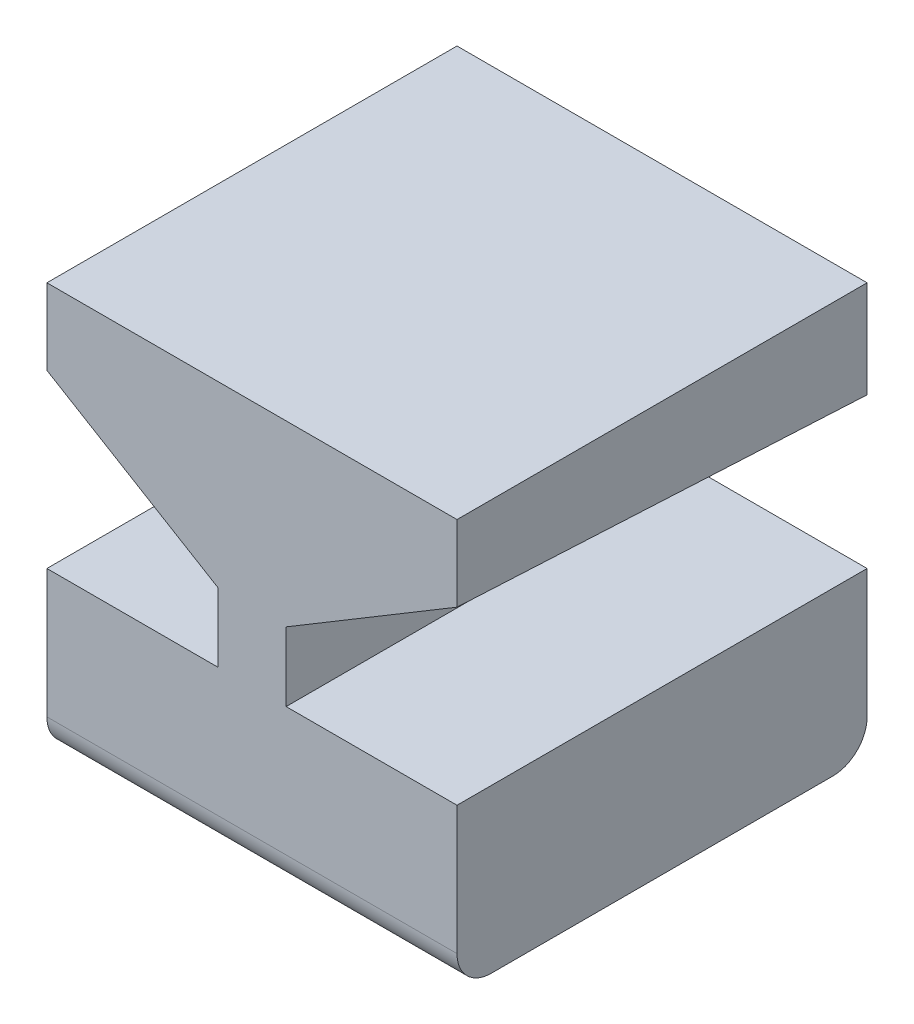
ISO-10303-21;
HEADER;
FILE_DESCRIPTION(('STEP AP214'),'2;1');
FILE_NAME('part.step','',(''),(''),'','','');
FILE_SCHEMA(('AUTOMOTIVE_DESIGN { 1 0 10303 214 1 1 1 1 }'));
ENDSEC;
DATA;
#1=APPLICATION_CONTEXT('core data for automotive mechanical design processes');
#2=APPLICATION_PROTOCOL_DEFINITION('international standard','automotive_design',2000,#1);
#3=PRODUCT_CONTEXT('',#1,'mechanical');
#4=PRODUCT('Part','Part','',(#3));
#5=PRODUCT_RELATED_PRODUCT_CATEGORY('part','',(#4));
#6=PRODUCT_DEFINITION_FORMATION('','',#4);
#7=PRODUCT_DEFINITION_CONTEXT('part definition',#1,'design');
#8=PRODUCT_DEFINITION('design','',#6,#7);
#9=PRODUCT_DEFINITION_SHAPE('','',#8);
#10=(LENGTH_UNIT() NAMED_UNIT(*) SI_UNIT(.MILLI.,.METRE.));
#11=(NAMED_UNIT(*) PLANE_ANGLE_UNIT() SI_UNIT($,.RADIAN.));
#12=(NAMED_UNIT(*) SI_UNIT($,.STERADIAN.) SOLID_ANGLE_UNIT());
#13=UNCERTAINTY_MEASURE_WITH_UNIT(LENGTH_MEASURE(1.E-05),#10,'distance_accuracy_value','');
#14=(GEOMETRIC_REPRESENTATION_CONTEXT(3) GLOBAL_UNCERTAINTY_ASSIGNED_CONTEXT((#13)) GLOBAL_UNIT_ASSIGNED_CONTEXT((#10,
#11,#12)) REPRESENTATION_CONTEXT('',''));
#15=CARTESIAN_POINT('',(0.,0.,0.));
#16=DIRECTION('',(0.,0.,1.));
#17=DIRECTION('',(1.,0.,0.));
#18=AXIS2_PLACEMENT_3D('',#15,#16,#17);
#19=CARTESIAN_POINT('',(0.,23.8,60.));
#20=DIRECTION('',(1.,0.,0.));
#21=DIRECTION('',(0.,0.,-1.));
#22=AXIS2_PLACEMENT_3D('',#19,#20,#21);
#23=PLANE('',#22);
#24=DIRECTION('',(0.,-1.,0.));
#25=VECTOR('',#24,1.);
#26=CARTESIAN_POINT('',(0.,23.8,0.));
#27=LINE('',#26,#25);
#28=CARTESIAN_POINT('',(0.,23.8,0.));
#29=VERTEX_POINT('',#28);
#30=CARTESIAN_POINT('',(0.,5.00000000000001,0.));
#31=VERTEX_POINT('',#30);
#32=EDGE_CURVE('E192',#29,#31,#27,.T.);
#33=ORIENTED_EDGE('',*,*,#32,.T.);
#34=CARTESIAN_POINT('',(0.,5.,5.));
#35=DIRECTION('',(1.,0.,0.));
#36=DIRECTION('',(0.,0.,-1.));
#37=AXIS2_PLACEMENT_3D('',#34,#35,#36);
#38=CIRCLE('',#37,5.);
#39=CARTESIAN_POINT('',(0.,0.,5.));
#40=VERTEX_POINT('',#39);
#41=EDGE_CURVE('E47',#31,#40,#38,.F.);
#42=ORIENTED_EDGE('',*,*,#41,.T.);
#43=DIRECTION('',(0.,0.,-1.));
#44=VECTOR('',#43,1.);
#45=CARTESIAN_POINT('',(0.,0.,60.));
#46=LINE('',#45,#44);
#47=CARTESIAN_POINT('',(0.,0.,55.));
#48=VERTEX_POINT('',#47);
#49=EDGE_CURVE('E251',#48,#40,#46,.T.);
#50=ORIENTED_EDGE('',*,*,#49,.F.);
#51=CARTESIAN_POINT('',(0.,5.,55.));
#52=DIRECTION('',(1.,0.,0.));
#53=DIRECTION('',(0.,0.,-1.));
#54=AXIS2_PLACEMENT_3D('',#51,#52,#53);
#55=CIRCLE('',#54,5.);
#56=CARTESIAN_POINT('',(0.,5.00000000000001,60.));
#57=VERTEX_POINT('',#56);
#58=EDGE_CURVE('E54',#48,#57,#55,.F.);
#59=ORIENTED_EDGE('',*,*,#58,.T.);
#60=DIRECTION('',(0.,-1.,0.));
#61=VECTOR('',#60,1.);
#62=CARTESIAN_POINT('',(0.,23.8,60.));
#63=LINE('',#62,#61);
#64=CARTESIAN_POINT('',(0.,23.8,60.));
#65=VERTEX_POINT('',#64);
#66=EDGE_CURVE('E225',#65,#57,#63,.T.);
#67=ORIENTED_EDGE('',*,*,#66,.F.);
#68=DIRECTION('',(0.,0.,-1.));
#69=VECTOR('',#68,1.);
#70=CARTESIAN_POINT('',(0.,23.8,60.));
#71=LINE('',#70,#69);
#72=EDGE_CURVE('E191',#65,#29,#71,.T.);
#73=ORIENTED_EDGE('',*,*,#72,.T.);
#74=EDGE_LOOP('',(#33,#42,#50,#59,#67,#73));
#75=FACE_BOUND('',#74,.T.);
#76=ADVANCED_FACE('F38',(#75),#23,.F.);
#77=CARTESIAN_POINT('',(0.,0.,60.));
#78=DIRECTION('',(0.,1.,0.));
#79=DIRECTION('',(0.,0.,1.));
#80=AXIS2_PLACEMENT_3D('',#77,#78,#79);
#81=PLANE('',#80);
#82=ORIENTED_EDGE('',*,*,#49,.T.);
#83=DIRECTION('',(1.,0.,0.));
#84=VECTOR('',#83,1.);
#85=CARTESIAN_POINT('',(0.,0.,5.));
#86=LINE('',#85,#84);
#87=CARTESIAN_POINT('',(60.,0.,5.));
#88=VERTEX_POINT('',#87);
#89=EDGE_CURVE('E258',#40,#88,#86,.T.);
#90=ORIENTED_EDGE('',*,*,#89,.T.);
#91=DIRECTION('',(0.,0.,-1.));
#92=VECTOR('',#91,1.);
#93=CARTESIAN_POINT('',(60.,0.,60.));
#94=LINE('',#93,#92);
#95=CARTESIAN_POINT('',(60.,0.,55.));
#96=VERTEX_POINT('',#95);
#97=EDGE_CURVE('E247',#96,#88,#94,.T.);
#98=ORIENTED_EDGE('',*,*,#97,.F.);
#99=DIRECTION('',(1.,0.,0.));
#100=VECTOR('',#99,1.);
#101=CARTESIAN_POINT('',(0.,0.,55.));
#102=LINE('',#101,#100);
#103=EDGE_CURVE('E255',#96,#48,#102,.F.);
#104=ORIENTED_EDGE('',*,*,#103,.T.);
#105=EDGE_LOOP('',(#82,#90,#98,#104));
#106=FACE_BOUND('',#105,.T.);
#107=ADVANCED_FACE('F276',(#106),#81,.F.);
#108=CARTESIAN_POINT('',(60.,0.,60.));
#109=DIRECTION('',(-1.,0.,0.));
#110=DIRECTION('',(0.,0.,1.));
#111=AXIS2_PLACEMENT_3D('',#108,#109,#110);
#112=PLANE('',#111);
#113=ORIENTED_EDGE('',*,*,#97,.T.);
#114=CARTESIAN_POINT('',(60.,5.,5.));
#115=DIRECTION('',(-1.,0.,0.));
#116=DIRECTION('',(0.,0.,1.));
#117=AXIS2_PLACEMENT_3D('',#114,#115,#116);
#118=CIRCLE('',#117,5.);
#119=CARTESIAN_POINT('',(60.,5.,0.));
#120=VERTEX_POINT('',#119);
#121=EDGE_CURVE('E265',#88,#120,#118,.F.);
#122=ORIENTED_EDGE('',*,*,#121,.T.);
#123=DIRECTION('',(0.,1.,0.));
#124=VECTOR('',#123,1.);
#125=CARTESIAN_POINT('',(60.,0.,0.));
#126=LINE('',#125,#124);
#127=CARTESIAN_POINT('',(60.,23.8,0.));
#128=VERTEX_POINT('',#127);
#129=EDGE_CURVE('E195',#120,#128,#126,.T.);
#130=ORIENTED_EDGE('',*,*,#129,.T.);
#131=DIRECTION('',(0.,0.,-1.));
#132=VECTOR('',#131,1.);
#133=CARTESIAN_POINT('',(60.,23.8,60.));
#134=LINE('',#133,#132);
#135=CARTESIAN_POINT('',(60.,23.8,60.));
#136=VERTEX_POINT('',#135);
#137=EDGE_CURVE('E243',#136,#128,#134,.T.);
#138=ORIENTED_EDGE('',*,*,#137,.F.);
#139=DIRECTION('',(0.,1.,0.));
#140=VECTOR('',#139,1.);
#141=CARTESIAN_POINT('',(60.,0.,60.));
#142=LINE('',#141,#140);
#143=CARTESIAN_POINT('',(60.,5.,60.));
#144=VERTEX_POINT('',#143);
#145=EDGE_CURVE('E307',#144,#136,#142,.T.);
#146=ORIENTED_EDGE('',*,*,#145,.F.);
#147=CARTESIAN_POINT('',(60.,5.,55.));
#148=DIRECTION('',(-1.,0.,0.));
#149=DIRECTION('',(0.,0.,1.));
#150=AXIS2_PLACEMENT_3D('',#147,#148,#149);
#151=CIRCLE('',#150,5.);
#152=EDGE_CURVE('E262',#144,#96,#151,.F.);
#153=ORIENTED_EDGE('',*,*,#152,.T.);
#154=EDGE_LOOP('',(#113,#122,#130,#138,#146,#153));
#155=FACE_BOUND('',#154,.T.);
#156=ADVANCED_FACE('F281',(#155),#112,.F.);
#157=CARTESIAN_POINT('',(60.,23.8,60.));
#158=DIRECTION('',(0.,-1.,0.));
#159=DIRECTION('',(1.,0.,0.));
#160=AXIS2_PLACEMENT_3D('',#157,#158,#159);
#161=PLANE('',#160);
#162=DIRECTION('',(-1.,0.,0.));
#163=VECTOR('',#162,1.);
#164=CARTESIAN_POINT('',(60.,23.8,0.));
#165=LINE('',#164,#163);
#166=CARTESIAN_POINT('',(35.,23.8,0.));
#167=VERTEX_POINT('',#166);
#168=EDGE_CURVE('E198',#128,#167,#165,.T.);
#169=ORIENTED_EDGE('',*,*,#168,.T.);
#170=DIRECTION('',(0.,0.,-1.));
#171=VECTOR('',#170,1.);
#172=CARTESIAN_POINT('',(35.,23.8,60.));
#173=LINE('',#172,#171);
#174=CARTESIAN_POINT('',(35.,23.8,60.));
#175=VERTEX_POINT('',#174);
#176=EDGE_CURVE('E239',#175,#167,#173,.T.);
#177=ORIENTED_EDGE('',*,*,#176,.F.);
#178=DIRECTION('',(-1.,0.,0.));
#179=VECTOR('',#178,1.);
#180=CARTESIAN_POINT('',(60.,23.8,60.));
#181=LINE('',#180,#179);
#182=EDGE_CURVE('E178',#136,#175,#181,.T.);
#183=ORIENTED_EDGE('',*,*,#182,.F.);
#184=ORIENTED_EDGE('',*,*,#137,.T.);
#185=EDGE_LOOP('',(#169,#177,#183,#184));
#186=FACE_BOUND('',#185,.T.);
#187=ADVANCED_FACE('F288',(#186),#161,.F.);
#188=CARTESIAN_POINT('',(35.,23.8,60.));
#189=DIRECTION('',(-1.,0.,0.));
#190=DIRECTION('',(0.,0.,1.));
#191=AXIS2_PLACEMENT_3D('',#188,#189,#190);
#192=PLANE('',#191);
#193=DIRECTION('',(0.,1.,0.));
#194=VECTOR('',#193,1.);
#195=CARTESIAN_POINT('',(35.,23.8,0.));
#196=LINE('',#195,#194);
#197=CARTESIAN_POINT('',(35.,30.8,0.));
#198=VERTEX_POINT('',#197);
#199=EDGE_CURVE('E201',#167,#198,#196,.T.);
#200=ORIENTED_EDGE('',*,*,#199,.T.);
#201=DIRECTION('',(0.,0.0515978437770678,0.998667944072281));
#202=VECTOR('',#201,1.);
#203=CARTESIAN_POINT('',(35.,29.2064024150824,-30.8438242242116));
#204=LINE('',#203,#202);
#205=CARTESIAN_POINT('',(35.,33.9,60.));
#206=VERTEX_POINT('',#205);
#207=EDGE_CURVE('E155',#198,#206,#204,.T.);
#208=ORIENTED_EDGE('',*,*,#207,.T.);
#209=DIRECTION('',(0.,1.,0.));
#210=VECTOR('',#209,1.);
#211=CARTESIAN_POINT('',(35.,23.8,60.));
#212=LINE('',#211,#210);
#213=EDGE_CURVE('E162',#175,#206,#212,.T.);
#214=ORIENTED_EDGE('',*,*,#213,.F.);
#215=ORIENTED_EDGE('',*,*,#176,.T.);
#216=EDGE_LOOP('',(#200,#208,#214,#215));
#217=FACE_BOUND('',#216,.T.);
#218=ADVANCED_FACE('F291',(#217),#192,.F.);
#219=CARTESIAN_POINT('',(60.,45.8,60.));
#220=DIRECTION('',(-1.,0.,0.));
#221=DIRECTION('',(0.,0.,1.));
#222=AXIS2_PLACEMENT_3D('',#219,#220,#221);
#223=PLANE('',#222);
#224=DIRECTION('',(0.,1.,0.));
#225=VECTOR('',#224,1.);
#226=CARTESIAN_POINT('',(60.,45.8,60.));
#227=LINE('',#226,#225);
#228=CARTESIAN_POINT('',(60.,48.9,60.));
#229=VERTEX_POINT('',#228);
#230=CARTESIAN_POINT('',(60.,60.,60.));
#231=VERTEX_POINT('',#230);
#232=EDGE_CURVE('E159',#229,#231,#227,.T.);
#233=ORIENTED_EDGE('',*,*,#232,.F.);
#234=DIRECTION('',(0.,0.0515978437770678,0.998667944072281));
#235=VECTOR('',#234,1.);
#236=CARTESIAN_POINT('',(60.,44.2064024150824,-30.8438242242116));
#237=LINE('',#236,#235);
#238=CARTESIAN_POINT('',(60.,45.8,0.));
#239=VERTEX_POINT('',#238);
#240=EDGE_CURVE('E144',#239,#229,#237,.T.);
#241=ORIENTED_EDGE('',*,*,#240,.F.);
#242=DIRECTION('',(0.,1.,0.));
#243=VECTOR('',#242,1.);
#244=CARTESIAN_POINT('',(60.,45.8,0.));
#245=LINE('',#244,#243);
#246=CARTESIAN_POINT('',(60.,60.,0.));
#247=VERTEX_POINT('',#246);
#248=EDGE_CURVE('E206',#239,#247,#245,.T.);
#249=ORIENTED_EDGE('',*,*,#248,.T.);
#250=DIRECTION('',(0.,0.,-1.));
#251=VECTOR('',#250,1.);
#252=CARTESIAN_POINT('',(60.,60.,60.));
#253=LINE('',#252,#251);
#254=EDGE_CURVE('E169',#231,#247,#253,.T.);
#255=ORIENTED_EDGE('',*,*,#254,.F.);
#256=EDGE_LOOP('',(#233,#241,#249,#255));
#257=FACE_BOUND('',#256,.T.);
#258=ADVANCED_FACE('F167',(#257),#223,.F.);
#259=CARTESIAN_POINT('',(60.,60.,60.));
#260=DIRECTION('',(0.,-1.,0.));
#261=DIRECTION('',(0.,0.,-1.));
#262=AXIS2_PLACEMENT_3D('',#259,#260,#261);
#263=PLANE('',#262);
#264=DIRECTION('',(-1.,0.,0.));
#265=VECTOR('',#264,1.);
#266=CARTESIAN_POINT('',(60.,60.,0.));
#267=LINE('',#266,#265);
#268=CARTESIAN_POINT('',(0.,60.,0.));
#269=VERTEX_POINT('',#268);
#270=EDGE_CURVE('E209',#247,#269,#267,.T.);
#271=ORIENTED_EDGE('',*,*,#270,.T.);
#272=DIRECTION('',(0.,0.,-1.));
#273=VECTOR('',#272,1.);
#274=CARTESIAN_POINT('',(0.,60.,60.));
#275=LINE('',#274,#273);
#276=CARTESIAN_POINT('',(0.,60.,60.));
#277=VERTEX_POINT('',#276);
#278=EDGE_CURVE('E233',#277,#269,#275,.T.);
#279=ORIENTED_EDGE('',*,*,#278,.F.);
#280=DIRECTION('',(-1.,0.,0.));
#281=VECTOR('',#280,1.);
#282=CARTESIAN_POINT('',(60.,60.,60.));
#283=LINE('',#282,#281);
#284=EDGE_CURVE('E172',#231,#277,#283,.T.);
#285=ORIENTED_EDGE('',*,*,#284,.F.);
#286=ORIENTED_EDGE('',*,*,#254,.T.);
#287=EDGE_LOOP('',(#271,#279,#285,#286));
#288=FACE_BOUND('',#287,.T.);
#289=ADVANCED_FACE('F332',(#288),#263,.F.);
#290=CARTESIAN_POINT('',(0.,60.,60.));
#291=DIRECTION('',(1.,0.,0.));
#292=DIRECTION('',(0.,1.,0.));
#293=AXIS2_PLACEMENT_3D('',#290,#291,#292);
#294=PLANE('',#293);
#295=DIRECTION('',(0.,-1.,0.));
#296=VECTOR('',#295,1.);
#297=CARTESIAN_POINT('',(0.,60.,0.));
#298=LINE('',#297,#296);
#299=CARTESIAN_POINT('',(0.,45.8,0.));
#300=VERTEX_POINT('',#299);
#301=EDGE_CURVE('E212',#269,#300,#298,.T.);
#302=ORIENTED_EDGE('',*,*,#301,.T.);
#303=DIRECTION('',(0.,0.0515978437770678,0.998667944072281));
#304=VECTOR('',#303,1.);
#305=CARTESIAN_POINT('',(0.,44.2064024150824,-30.8438242242116));
#306=LINE('',#305,#304);
#307=CARTESIAN_POINT('',(0.,48.9,60.));
#308=VERTEX_POINT('',#307);
#309=EDGE_CURVE('E165',#300,#308,#306,.T.);
#310=ORIENTED_EDGE('',*,*,#309,.T.);
#311=DIRECTION('',(0.,-1.,0.));
#312=VECTOR('',#311,1.);
#313=CARTESIAN_POINT('',(0.,60.,60.));
#314=LINE('',#313,#312);
#315=EDGE_CURVE('E176',#277,#308,#314,.T.);
#316=ORIENTED_EDGE('',*,*,#315,.F.);
#317=ORIENTED_EDGE('',*,*,#278,.T.);
#318=EDGE_LOOP('',(#302,#310,#316,#317));
#319=FACE_BOUND('',#318,.T.);
#320=ADVANCED_FACE('F335',(#319),#294,.F.);
#321=CARTESIAN_POINT('',(25.,30.8,60.));
#322=DIRECTION('',(1.,0.,0.));
#323=DIRECTION('',(0.,0.,-1.));
#324=AXIS2_PLACEMENT_3D('',#321,#322,#323);
#325=PLANE('',#324);
#326=DIRECTION('',(0.,-1.,0.));
#327=VECTOR('',#326,1.);
#328=CARTESIAN_POINT('',(25.,30.8,60.));
#329=LINE('',#328,#327);
#330=CARTESIAN_POINT('',(25.,33.9,60.));
#331=VERTEX_POINT('',#330);
#332=CARTESIAN_POINT('',(25.,23.8,60.));
#333=VERTEX_POINT('',#332);
#334=EDGE_CURVE('E185',#331,#333,#329,.T.);
#335=ORIENTED_EDGE('',*,*,#334,.F.);
#336=DIRECTION('',(0.,0.0515978437770678,0.998667944072281));
#337=VECTOR('',#336,1.);
#338=CARTESIAN_POINT('',(25.,29.2064024150824,-30.8438242242116));
#339=LINE('',#338,#337);
#340=CARTESIAN_POINT('',(25.,30.8,0.));
#341=VERTEX_POINT('',#340);
#342=EDGE_CURVE('E298',#341,#331,#339,.T.);
#343=ORIENTED_EDGE('',*,*,#342,.F.);
#344=DIRECTION('',(0.,-1.,0.));
#345=VECTOR('',#344,1.);
#346=CARTESIAN_POINT('',(25.,30.8,0.));
#347=LINE('',#346,#345);
#348=CARTESIAN_POINT('',(25.,23.8,0.));
#349=VERTEX_POINT('',#348);
#350=EDGE_CURVE('E219',#341,#349,#347,.T.);
#351=ORIENTED_EDGE('',*,*,#350,.T.);
#352=DIRECTION('',(0.,0.,-1.));
#353=VECTOR('',#352,1.);
#354=CARTESIAN_POINT('',(25.,23.8,60.));
#355=LINE('',#354,#353);
#356=EDGE_CURVE('E229',#333,#349,#355,.T.);
#357=ORIENTED_EDGE('',*,*,#356,.F.);
#358=EDGE_LOOP('',(#335,#343,#351,#357));
#359=FACE_BOUND('',#358,.T.);
#360=ADVANCED_FACE('F339',(#359),#325,.F.);
#361=CARTESIAN_POINT('',(25.,23.8,60.));
#362=DIRECTION('',(0.,-1.,0.));
#363=DIRECTION('',(1.,0.,0.));
#364=AXIS2_PLACEMENT_3D('',#361,#362,#363);
#365=PLANE('',#364);
#366=DIRECTION('',(-1.,0.,0.));
#367=VECTOR('',#366,1.);
#368=CARTESIAN_POINT('',(25.,23.8,0.));
#369=LINE('',#368,#367);
#370=EDGE_CURVE('E222',#349,#29,#369,.T.);
#371=ORIENTED_EDGE('',*,*,#370,.T.);
#372=ORIENTED_EDGE('',*,*,#72,.F.);
#373=DIRECTION('',(-1.,0.,0.));
#374=VECTOR('',#373,1.);
#375=CARTESIAN_POINT('',(25.,23.8,60.));
#376=LINE('',#375,#374);
#377=EDGE_CURVE('E188',#333,#65,#376,.T.);
#378=ORIENTED_EDGE('',*,*,#377,.F.);
#379=ORIENTED_EDGE('',*,*,#356,.T.);
#380=EDGE_LOOP('',(#371,#372,#378,#379));
#381=FACE_BOUND('',#380,.T.);
#382=ADVANCED_FACE('F343',(#381),#365,.F.);
#383=CARTESIAN_POINT('',(0.,0.,60.));
#384=DIRECTION('',(0.,0.,1.));
#385=DIRECTION('',(1.,0.,0.));
#386=AXIS2_PLACEMENT_3D('',#383,#384,#385);
#387=PLANE('',#386);
#388=ORIENTED_EDGE('',*,*,#66,.T.);
#389=DIRECTION('',(1.,0.,0.));
#390=VECTOR('',#389,1.);
#391=CARTESIAN_POINT('',(60.,5.,60.));
#392=LINE('',#391,#390);
#393=EDGE_CURVE('E11',#57,#144,#392,.T.);
#394=ORIENTED_EDGE('',*,*,#393,.T.);
#395=ORIENTED_EDGE('',*,*,#145,.T.);
#396=ORIENTED_EDGE('',*,*,#182,.T.);
#397=ORIENTED_EDGE('',*,*,#213,.T.);
#398=DIRECTION('',(-0.857492925712544,-0.514495755427526,0.));
#399=VECTOR('',#398,1.);
#400=CARTESIAN_POINT('',(35.,33.9,60.));
#401=LINE('',#400,#399);
#402=EDGE_CURVE('E148',#229,#206,#401,.T.);
#403=ORIENTED_EDGE('',*,*,#402,.F.);
#404=ORIENTED_EDGE('',*,*,#232,.T.);
#405=ORIENTED_EDGE('',*,*,#284,.T.);
#406=ORIENTED_EDGE('',*,*,#315,.T.);
#407=DIRECTION('',(-0.857492925712544,0.514495755427526,0.));
#408=VECTOR('',#407,1.);
#409=CARTESIAN_POINT('',(0.,48.9,60.));
#410=LINE('',#409,#408);
#411=EDGE_CURVE('E295',#331,#308,#410,.T.);
#412=ORIENTED_EDGE('',*,*,#411,.F.);
#413=ORIENTED_EDGE('',*,*,#334,.T.);
#414=ORIENTED_EDGE('',*,*,#377,.T.);
#415=EDGE_LOOP('',(#388,#394,#395,#396,#397,#403,#404,#405,#406,#412,#413,#414));
#416=FACE_BOUND('',#415,.T.);
#417=ADVANCED_FACE('F158',(#416),#387,.T.);
#418=CARTESIAN_POINT('',(0.,0.,0.));
#419=DIRECTION('',(0.,0.,1.));
#420=DIRECTION('',(1.,0.,0.));
#421=AXIS2_PLACEMENT_3D('',#418,#419,#420);
#422=PLANE('',#421);
#423=ORIENTED_EDGE('',*,*,#129,.F.);
#424=DIRECTION('',(1.,0.,0.));
#425=VECTOR('',#424,1.);
#426=CARTESIAN_POINT('',(0.,5.,0.));
#427=LINE('',#426,#425);
#428=EDGE_CURVE('E62',#120,#31,#427,.F.);
#429=ORIENTED_EDGE('',*,*,#428,.T.);
#430=ORIENTED_EDGE('',*,*,#32,.F.);
#431=ORIENTED_EDGE('',*,*,#370,.F.);
#432=ORIENTED_EDGE('',*,*,#350,.F.);
#433=DIRECTION('',(0.857492925712544,-0.514495755427526,0.));
#434=VECTOR('',#433,1.);
#435=CARTESIAN_POINT('',(0.,45.8,0.));
#436=LINE('',#435,#434);
#437=EDGE_CURVE('E216',#300,#341,#436,.T.);
#438=ORIENTED_EDGE('',*,*,#437,.F.);
#439=ORIENTED_EDGE('',*,*,#301,.F.);
#440=ORIENTED_EDGE('',*,*,#270,.F.);
#441=ORIENTED_EDGE('',*,*,#248,.F.);
#442=DIRECTION('',(0.857492925712544,0.514495755427526,0.));
#443=VECTOR('',#442,1.);
#444=CARTESIAN_POINT('',(35.,30.8,0.));
#445=LINE('',#444,#443);
#446=EDGE_CURVE('E150',#198,#239,#445,.T.);
#447=ORIENTED_EDGE('',*,*,#446,.F.);
#448=ORIENTED_EDGE('',*,*,#199,.F.);
#449=ORIENTED_EDGE('',*,*,#168,.F.);
#450=EDGE_LOOP('',(#423,#429,#430,#431,#432,#438,#439,#440,#441,#447,#448,#449));
#451=FACE_BOUND('',#450,.T.);
#452=ADVANCED_FACE('F284',(#451),#422,.F.);
#453=CARTESIAN_POINT('',(0.,44.2064024150824,-30.8438242242116));
#454=DIRECTION('',(0.513991564507879,0.856652607513131,-0.0442603847215118));
#455=DIRECTION('',(-0.857492925712544,0.514495755427526,0.));
#456=AXIS2_PLACEMENT_3D('',#453,#454,#455);
#457=PLANE('',#456);
#458=ORIENTED_EDGE('',*,*,#437,.T.);
#459=ORIENTED_EDGE('',*,*,#342,.T.);
#460=ORIENTED_EDGE('',*,*,#411,.T.);
#461=ORIENTED_EDGE('',*,*,#309,.F.);
#462=EDGE_LOOP('',(#458,#459,#460,#461));
#463=FACE_BOUND('',#462,.T.);
#464=ADVANCED_FACE('F350',(#463),#457,.F.);
#465=CARTESIAN_POINT('',(35.,29.2064024150824,-30.8438242242116));
#466=DIRECTION('',(-0.513991564507879,0.856652607513131,-0.0442603847215118));
#467=DIRECTION('',(-0.857492925712544,-0.514495755427526,0.));
#468=AXIS2_PLACEMENT_3D('',#465,#466,#467);
#469=PLANE('',#468);
#470=ORIENTED_EDGE('',*,*,#446,.T.);
#471=ORIENTED_EDGE('',*,*,#240,.T.);
#472=ORIENTED_EDGE('',*,*,#402,.T.);
#473=ORIENTED_EDGE('',*,*,#207,.F.);
#474=EDGE_LOOP('',(#470,#471,#472,#473));
#475=FACE_BOUND('',#474,.T.);
#476=ADVANCED_FACE('F146',(#475),#469,.F.);
#477=CARTESIAN_POINT('',(0.,5.,5.));
#478=DIRECTION('',(1.,0.,0.));
#479=DIRECTION('',(0.,0.,-1.));
#480=AXIS2_PLACEMENT_3D('',#477,#478,#479);
#481=CYLINDRICAL_SURFACE('',#480,5.);
#482=ORIENTED_EDGE('',*,*,#41,.F.);
#483=ORIENTED_EDGE('',*,*,#428,.F.);
#484=ORIENTED_EDGE('',*,*,#121,.F.);
#485=ORIENTED_EDGE('',*,*,#89,.F.);
#486=EDGE_LOOP('',(#482,#483,#484,#485));
#487=FACE_BOUND('',#486,.T.);
#488=ADVANCED_FACE('F279',(#487),#481,.T.);
#489=CARTESIAN_POINT('',(0.,5.,55.));
#490=DIRECTION('',(-1.,0.,0.));
#491=DIRECTION('',(0.,0.,1.));
#492=AXIS2_PLACEMENT_3D('',#489,#490,#491);
#493=CYLINDRICAL_SURFACE('',#492,5.);
#494=ORIENTED_EDGE('',*,*,#58,.F.);
#495=ORIENTED_EDGE('',*,*,#103,.F.);
#496=ORIENTED_EDGE('',*,*,#152,.F.);
#497=ORIENTED_EDGE('',*,*,#393,.F.);
#498=EDGE_LOOP('',(#494,#495,#496,#497));
#499=FACE_BOUND('',#498,.T.);
#500=ADVANCED_FACE('F40',(#499),#493,.T.);
#501=CLOSED_SHELL('',(#76,#107,#156,#187,#218,#258,#289,#320,#360,#382,#417,#452,#464,#476,#488,#500));
#502=MANIFOLD_SOLID_BREP('B2',#501);
#503=ADVANCED_BREP_SHAPE_REPRESENTATION('',(#18,#502),#14);
#504=SHAPE_DEFINITION_REPRESENTATION(#9,#503);
ENDSEC;
END-ISO-10303-21;
